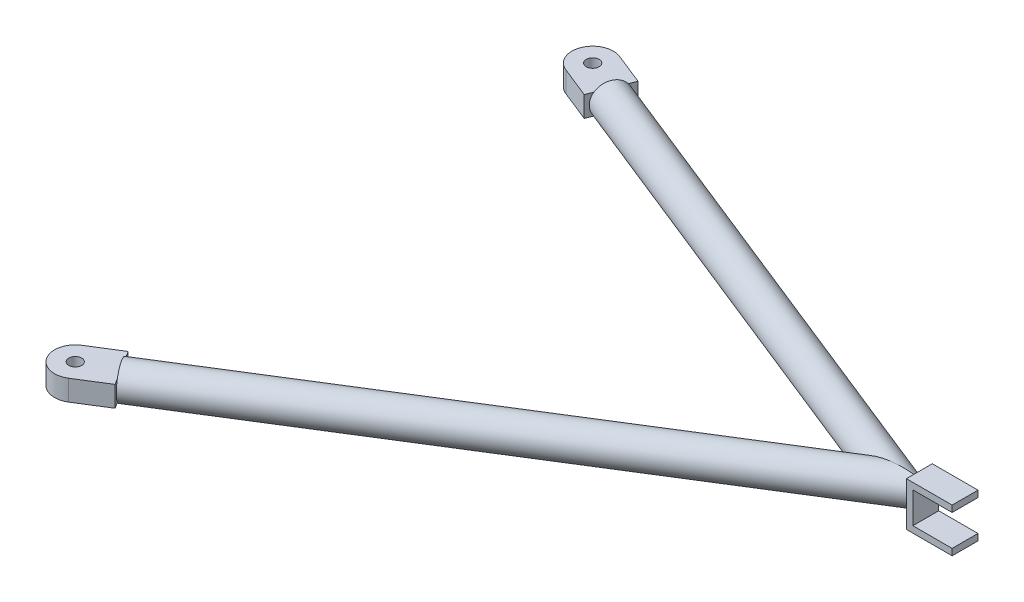
ISO-10303-21;
HEADER;
FILE_DESCRIPTION(('STEP AP214'),'2;1');
FILE_NAME('part.step','',(''),(''),'','','');
FILE_SCHEMA(('AUTOMOTIVE_DESIGN { 1 0 10303 214 1 1 1 1 }'));
ENDSEC;
DATA;
#1=APPLICATION_CONTEXT('core data for automotive mechanical design processes');
#2=APPLICATION_PROTOCOL_DEFINITION('international standard','automotive_design',2000,#1);
#3=PRODUCT_CONTEXT('',#1,'mechanical');
#4=PRODUCT('Part','Part','',(#3));
#5=PRODUCT_RELATED_PRODUCT_CATEGORY('part','',(#4));
#6=PRODUCT_DEFINITION_FORMATION('','',#4);
#7=PRODUCT_DEFINITION_CONTEXT('part definition',#1,'design');
#8=PRODUCT_DEFINITION('design','',#6,#7);
#9=PRODUCT_DEFINITION_SHAPE('','',#8);
#10=(LENGTH_UNIT() NAMED_UNIT(*) SI_UNIT(.MILLI.,.METRE.));
#11=(NAMED_UNIT(*) PLANE_ANGLE_UNIT() SI_UNIT($,.RADIAN.));
#12=(NAMED_UNIT(*) SI_UNIT($,.STERADIAN.) SOLID_ANGLE_UNIT());
#13=UNCERTAINTY_MEASURE_WITH_UNIT(LENGTH_MEASURE(1.E-05),#10,'distance_accuracy_value','');
#14=(GEOMETRIC_REPRESENTATION_CONTEXT(3) GLOBAL_UNCERTAINTY_ASSIGNED_CONTEXT((#13)) GLOBAL_UNIT_ASSIGNED_CONTEXT((#10,
#11,#12)) REPRESENTATION_CONTEXT('',''));
#15=CARTESIAN_POINT('',(0.,0.,0.));
#16=DIRECTION('',(0.,0.,1.));
#17=DIRECTION('',(1.,0.,0.));
#18=AXIS2_PLACEMENT_3D('',#15,#16,#17);
#19=CARTESIAN_POINT('',(-247.620690573304,0.,-99.06));
#20=DIRECTION('',(0.928461531958395,0.,0.371428571428571));
#21=DIRECTION('',(0.371428571428572,0.,-0.928461531958396));
#22=AXIS2_PLACEMENT_3D('',#19,#20,#21);
#23=CYLINDRICAL_SURFACE('',#22,8.25500000000001);
#24=CARTESIAN_POINT('',(11.8110000000001,0.,4.72495919985996));
#25=DIRECTION('',(-1.,0.,0.));
#26=DIRECTION('',(0.,0.,1.));
#27=AXIS2_PLACEMENT_3D('',#24,#25,#26);
#28=ELLIPSE('',#27,8.89105225780094,8.25500000000001);
#29=CARTESIAN_POINT('',(11.8110000000001,-6.27078691992011,-1.05733352724137));
#30=VERTEX_POINT('',#29);
#31=CARTESIAN_POINT('',(11.8110000000001,6.27078691992011,-1.05733352724137));
#32=VERTEX_POINT('',#31);
#33=EDGE_CURVE('E61',#30,#32,#28,.F.);
#34=ORIENTED_EDGE('',*,*,#33,.F.);
#35=CARTESIAN_POINT('',(0.,0.,0.));
#36=DIRECTION('',(0.0891645140120563,0.,0.996016912226391));
#37=DIRECTION('',(0.996016912226391,0.,-0.0891645140120563));
#38=AXIS2_PLACEMENT_3D('',#35,#36,#37);
#39=ELLIPSE('',#38,18.2336261333202,8.25500000000001);
#40=EDGE_CURVE('E225',#30,#32,#39,.F.);
#41=ORIENTED_EDGE('',*,*,#40,.T.);
#42=EDGE_LOOP('',(#34,#41));
#43=FACE_BOUND('',#42,.T.);
#44=CARTESIAN_POINT('',(-232.527619909788,0.,-93.0220571428572));
#45=DIRECTION('',(-0.928461531958395,0.,-0.371428571428572));
#46=DIRECTION('',(-0.371428571428572,0.,0.928461531958395));
#47=AXIS2_PLACEMENT_3D('',#44,#45,#46);
#48=CIRCLE('',#47,8.25500000000001);
#49=CARTESIAN_POINT('',(-234.944436440445,5.08,-86.9807308930058));
#50=VERTEX_POINT('',#49);
#51=CARTESIAN_POINT('',(-234.944436440445,-5.08,-86.9807308930058));
#52=VERTEX_POINT('',#51);
#53=EDGE_CURVE('E44',#50,#52,#48,.F.);
#54=ORIENTED_EDGE('',*,*,#53,.T.);
#55=CARTESIAN_POINT('',(-232.527619909788,0.,-93.0220571428572));
#56=DIRECTION('',(-0.928461531958395,0.,-0.371428571428572));
#57=DIRECTION('',(-0.371428571428572,0.,0.928461531958395));
#58=AXIS2_PLACEMENT_3D('',#55,#56,#57);
#59=CIRCLE('',#58,8.255);
#60=CARTESIAN_POINT('',(-230.110803379131,-5.08,-99.0633833927085));
#61=VERTEX_POINT('',#60);
#62=EDGE_CURVE('E194',#52,#61,#59,.F.);
#63=ORIENTED_EDGE('',*,*,#62,.T.);
#64=CARTESIAN_POINT('',(-230.110803379131,5.08,-99.0633833927085));
#65=VERTEX_POINT('',#64);
#66=EDGE_CURVE('E11',#61,#65,#48,.F.);
#67=ORIENTED_EDGE('',*,*,#66,.T.);
#68=CARTESIAN_POINT('',(-232.527619909788,0.,-93.0220571428572));
#69=DIRECTION('',(-0.928461531958395,0.,-0.371428571428572));
#70=DIRECTION('',(-0.371428571428572,0.,0.928461531958395));
#71=AXIS2_PLACEMENT_3D('',#68,#69,#70);
#72=CIRCLE('',#71,8.255);
#73=EDGE_CURVE('E214',#65,#50,#72,.F.);
#74=ORIENTED_EDGE('',*,*,#73,.T.);
#75=EDGE_LOOP('',(#54,#63,#67,#74));
#76=FACE_BOUND('',#75,.T.);
#77=ADVANCED_FACE('F40',(#43,#76),#23,.T.);
#78=CARTESIAN_POINT('',(15.2452595311789,0.,-9.53918877413676));
#79=DIRECTION('',(-0.847725746570709,0.,0.530434782608696));
#80=DIRECTION('',(0.530434782608696,0.,0.847725746570709));
#81=AXIS2_PLACEMENT_3D('',#78,#79,#80);
#82=CYLINDRICAL_SURFACE('',#81,8.25500000000001);
#83=CARTESIAN_POINT('',(11.8110000000001,0.,-7.39032079978092));
#84=DIRECTION('',(-1.,0.,0.));
#85=DIRECTION('',(0.,0.,1.));
#86=AXIS2_PLACEMENT_3D('',#83,#84,#85);
#87=ELLIPSE('',#86,9.73781913949626,8.25500000000001);
#88=EDGE_CURVE('E227',#32,#30,#87,.F.);
#89=ORIENTED_EDGE('',*,*,#88,.F.);
#90=ORIENTED_EDGE('',*,*,#40,.F.);
#91=EDGE_LOOP('',(#89,#90));
#92=FACE_BOUND('',#91,.T.);
#93=CARTESIAN_POINT('',(-233.624738497422,0.,146.182521739131));
#94=DIRECTION('',(-0.847725746570709,0.,0.530434782608696));
#95=DIRECTION('',(0.530434782608696,0.,0.847725746570709));
#96=AXIS2_PLACEMENT_3D('',#93,#94,#95);
#97=CIRCLE('',#96,8.25500000000001);
#98=CARTESIAN_POINT('',(-230.173298167688,5.08,151.698515271604));
#99=VERTEX_POINT('',#98);
#100=CARTESIAN_POINT('',(-230.173298167688,-5.08,151.698515271604));
#101=VERTEX_POINT('',#100);
#102=EDGE_CURVE('E217',#99,#101,#97,.F.);
#103=ORIENTED_EDGE('',*,*,#102,.T.);
#104=CARTESIAN_POINT('',(-233.624738497422,0.,146.182521739131));
#105=DIRECTION('',(-0.847725746570709,0.,0.530434782608696));
#106=DIRECTION('',(0.530434782608696,0.,0.847725746570709));
#107=AXIS2_PLACEMENT_3D('',#104,#105,#106);
#108=CIRCLE('',#107,8.25500000000002);
#109=CARTESIAN_POINT('',(-237.076178827156,-5.08,140.666528206658));
#110=VERTEX_POINT('',#109);
#111=EDGE_CURVE('E356',#101,#110,#108,.F.);
#112=ORIENTED_EDGE('',*,*,#111,.T.);
#113=CARTESIAN_POINT('',(-237.076178827156,5.08,140.666528206658));
#114=VERTEX_POINT('',#113);
#115=EDGE_CURVE('E215',#110,#114,#97,.F.);
#116=ORIENTED_EDGE('',*,*,#115,.T.);
#117=CARTESIAN_POINT('',(-233.624738497422,0.,146.182521739131));
#118=DIRECTION('',(-0.847725746570709,0.,0.530434782608696));
#119=DIRECTION('',(0.530434782608696,0.,0.847725746570709));
#120=AXIS2_PLACEMENT_3D('',#117,#118,#119);
#121=CIRCLE('',#120,8.25500000000002);
#122=EDGE_CURVE('E193',#114,#99,#121,.F.);
#123=ORIENTED_EDGE('',*,*,#122,.T.);
#124=EDGE_LOOP('',(#103,#112,#116,#123));
#125=FACE_BOUND('',#124,.T.);
#126=ADVANCED_FACE('F42',(#92,#125),#82,.T.);
#127=CARTESIAN_POINT('',(-239.013955888726,-5.08,137.569628153972));
#128=DIRECTION('',(0.,-1.,0.));
#129=DIRECTION('',(0.,0.,-1.));
#130=AXIS2_PLACEMENT_3D('',#127,#128,#129);
#131=PLANE('',#130);
#132=CARTESIAN_POINT('',(-247.620690573304,-5.08,154.94));
#133=DIRECTION('',(0.,-1.,0.));
#134=DIRECTION('',(0.,0.,-1.));
#135=AXIS2_PLACEMENT_3D('',#132,#133,#134);
#136=CIRCLE('',#135,3.175);
#137=CARTESIAN_POINT('',(-247.620690573304,-5.08,151.765));
#138=VERTEX_POINT('',#137);
#139=EDGE_CURVE('E361',#138,#138,#136,.T.);
#140=ORIENTED_EDGE('',*,*,#139,.F.);
#141=EDGE_LOOP('',(#140));
#142=FACE_BOUND('',#141,.T.);
#143=CARTESIAN_POINT('',(-247.620690573304,-5.08,154.94));
#144=DIRECTION('',(0.,-1.,0.));
#145=DIRECTION('',(0.,0.,-1.));
#146=AXIS2_PLACEMENT_3D('',#143,#144,#145);
#147=CIRCLE('',#146,10.16);
#148=CARTESIAN_POINT('',(-253.009907964609,-5.08,146.327106414842));
#149=VERTEX_POINT('',#148);
#150=CARTESIAN_POINT('',(-242.231473182,-5.08,163.552893585159));
#151=VERTEX_POINT('',#150);
#152=EDGE_CURVE('E345',#149,#151,#147,.F.);
#153=ORIENTED_EDGE('',*,*,#152,.F.);
#154=DIRECTION('',(-0.847725746570709,0.,0.530434782608696));
#155=VECTOR('',#154,1.);
#156=CARTESIAN_POINT('',(-239.013955888726,-5.08,137.569628153972));
#157=LINE('',#156,#155);
#158=CARTESIAN_POINT('',(-239.013955888726,-5.08,137.569628153972));
#159=VERTEX_POINT('',#158);
#160=EDGE_CURVE('E301',#159,#149,#157,.T.);
#161=ORIENTED_EDGE('',*,*,#160,.F.);
#162=DIRECTION('',(0.530434782608696,0.,0.847725746570709));
#163=VECTOR('',#162,1.);
#164=CARTESIAN_POINT('',(-239.013955888726,-5.08,137.569628153972));
#165=LINE('',#164,#163);
#166=EDGE_CURVE('E298',#159,#110,#165,.T.);
#167=ORIENTED_EDGE('',*,*,#166,.T.);
#168=DIRECTION('',(0.530434782608696,0.,0.847725746570709));
#169=VECTOR('',#168,1.);
#170=CARTESIAN_POINT('',(-230.173298167688,-5.08,151.698515271604));
#171=LINE('',#170,#169);
#172=EDGE_CURVE('E54',#110,#101,#171,.T.);
#173=ORIENTED_EDGE('',*,*,#172,.T.);
#174=CARTESIAN_POINT('',(-228.235521106118,-5.08,154.795415324289));
#175=VERTEX_POINT('',#174);
#176=EDGE_CURVE('E308',#101,#175,#165,.T.);
#177=ORIENTED_EDGE('',*,*,#176,.T.);
#178=DIRECTION('',(-0.847725746570709,0.,0.530434782608696));
#179=VECTOR('',#178,1.);
#180=CARTESIAN_POINT('',(-228.235521106118,-5.08,154.795415324289));
#181=LINE('',#180,#179);
#182=EDGE_CURVE('E293',#175,#151,#181,.T.);
#183=ORIENTED_EDGE('',*,*,#182,.T.);
#184=EDGE_LOOP('',(#153,#161,#167,#173,#177,#183));
#185=FACE_BOUND('',#184,.T.);
#186=ADVANCED_FACE('F412',(#142,#185),#131,.T.);
#187=CARTESIAN_POINT('',(-239.013955888726,5.08,137.569628153972));
#188=DIRECTION('',(-0.530434782608696,0.,-0.847725746570709));
#189=DIRECTION('',(-0.847725746570709,0.,0.530434782608696));
#190=AXIS2_PLACEMENT_3D('',#187,#188,#189);
#191=PLANE('',#190);
#192=ORIENTED_EDGE('',*,*,#160,.T.);
#193=DIRECTION('',(0.,1.,0.));
#194=VECTOR('',#193,1.);
#195=CARTESIAN_POINT('',(-253.009907964609,-10.795,146.327106414842));
#196=LINE('',#195,#194);
#197=CARTESIAN_POINT('',(-253.009907964609,5.08,146.327106414842));
#198=VERTEX_POINT('',#197);
#199=EDGE_CURVE('E351',#149,#198,#196,.T.);
#200=ORIENTED_EDGE('',*,*,#199,.T.);
#201=DIRECTION('',(-0.847725746570709,0.,0.530434782608696));
#202=VECTOR('',#201,1.);
#203=CARTESIAN_POINT('',(-239.013955888726,5.08,137.569628153972));
#204=LINE('',#203,#202);
#205=CARTESIAN_POINT('',(-239.013955888726,5.08,137.569628153972));
#206=VERTEX_POINT('',#205);
#207=EDGE_CURVE('E297',#206,#198,#204,.T.);
#208=ORIENTED_EDGE('',*,*,#207,.F.);
#209=DIRECTION('',(0.,-1.,0.));
#210=VECTOR('',#209,1.);
#211=CARTESIAN_POINT('',(-239.013955888726,5.08,137.569628153972));
#212=LINE('',#211,#210);
#213=EDGE_CURVE('E309',#206,#159,#212,.T.);
#214=ORIENTED_EDGE('',*,*,#213,.T.);
#215=EDGE_LOOP('',(#192,#200,#208,#214));
#216=FACE_BOUND('',#215,.T.);
#217=ADVANCED_FACE('F463',(#216),#191,.T.);
#218=CARTESIAN_POINT('',(-239.013955888726,5.08,137.569628153972));
#219=DIRECTION('',(0.,1.,0.));
#220=DIRECTION('',(0.,0.,1.));
#221=AXIS2_PLACEMENT_3D('',#218,#219,#220);
#222=PLANE('',#221);
#223=CARTESIAN_POINT('',(-247.620690573304,5.08,154.94));
#224=DIRECTION('',(0.,1.,0.));
#225=DIRECTION('',(0.,0.,1.));
#226=AXIS2_PLACEMENT_3D('',#223,#224,#225);
#227=CIRCLE('',#226,3.17500000000001);
#228=CARTESIAN_POINT('',(-247.620690573304,5.08,158.115));
#229=VERTEX_POINT('',#228);
#230=EDGE_CURVE('E365',#229,#229,#227,.T.);
#231=ORIENTED_EDGE('',*,*,#230,.F.);
#232=EDGE_LOOP('',(#231));
#233=FACE_BOUND('',#232,.T.);
#234=DIRECTION('',(-0.530434782608696,0.,-0.847725746570709));
#235=VECTOR('',#234,1.);
#236=CARTESIAN_POINT('',(-237.076178827156,5.08,140.666528206658));
#237=LINE('',#236,#235);
#238=EDGE_CURVE('E354',#99,#114,#237,.T.);
#239=ORIENTED_EDGE('',*,*,#238,.T.);
#240=DIRECTION('',(-0.530434782608696,0.,-0.847725746570709));
#241=VECTOR('',#240,1.);
#242=CARTESIAN_POINT('',(-239.013955888726,5.08,137.569628153972));
#243=LINE('',#242,#241);
#244=EDGE_CURVE('E315',#114,#206,#243,.T.);
#245=ORIENTED_EDGE('',*,*,#244,.T.);
#246=ORIENTED_EDGE('',*,*,#207,.T.);
#247=CARTESIAN_POINT('',(-247.620690573304,5.08,154.94));
#248=DIRECTION('',(0.,-1.,0.));
#249=DIRECTION('',(0.,0.,1.));
#250=AXIS2_PLACEMENT_3D('',#247,#248,#249);
#251=CIRCLE('',#250,10.16);
#252=CARTESIAN_POINT('',(-242.231473182,5.08,163.552893585159));
#253=VERTEX_POINT('',#252);
#254=EDGE_CURVE('E349',#253,#198,#251,.T.);
#255=ORIENTED_EDGE('',*,*,#254,.F.);
#256=DIRECTION('',(-0.847725746570709,0.,0.530434782608696));
#257=VECTOR('',#256,1.);
#258=CARTESIAN_POINT('',(-228.235521106118,5.08,154.795415324289));
#259=LINE('',#258,#257);
#260=CARTESIAN_POINT('',(-228.235521106118,5.08,154.795415324289));
#261=VERTEX_POINT('',#260);
#262=EDGE_CURVE('E294',#261,#253,#259,.T.);
#263=ORIENTED_EDGE('',*,*,#262,.F.);
#264=EDGE_CURVE('E312',#261,#99,#243,.T.);
#265=ORIENTED_EDGE('',*,*,#264,.T.);
#266=EDGE_LOOP('',(#239,#245,#246,#255,#263,#265));
#267=FACE_BOUND('',#266,.T.);
#268=ADVANCED_FACE('F459',(#233,#267),#222,.T.);
#269=CARTESIAN_POINT('',(-228.235521106118,5.08,154.795415324289));
#270=DIRECTION('',(0.530434782608696,0.,0.847725746570709));
#271=DIRECTION('',(0.847725746570709,0.,-0.530434782608696));
#272=AXIS2_PLACEMENT_3D('',#269,#270,#271);
#273=PLANE('',#272);
#274=ORIENTED_EDGE('',*,*,#262,.T.);
#275=DIRECTION('',(0.,1.,0.));
#276=VECTOR('',#275,1.);
#277=CARTESIAN_POINT('',(-242.231473182,-10.795,163.552893585159));
#278=LINE('',#277,#276);
#279=EDGE_CURVE('E347',#151,#253,#278,.T.);
#280=ORIENTED_EDGE('',*,*,#279,.F.);
#281=ORIENTED_EDGE('',*,*,#182,.F.);
#282=DIRECTION('',(0.,1.,0.));
#283=VECTOR('',#282,1.);
#284=CARTESIAN_POINT('',(-228.235521106118,5.08,154.795415324289));
#285=LINE('',#284,#283);
#286=EDGE_CURVE('E316',#175,#261,#285,.T.);
#287=ORIENTED_EDGE('',*,*,#286,.T.);
#288=EDGE_LOOP('',(#274,#280,#281,#287));
#289=FACE_BOUND('',#288,.T.);
#290=ADVANCED_FACE('F456',(#289),#273,.T.);
#291=CARTESIAN_POINT('',(-228.753905624074,-5.08,-102.455226307554));
#292=DIRECTION('',(0.,-1.,0.));
#293=DIRECTION('',(0.,0.,-1.));
#294=AXIS2_PLACEMENT_3D('',#291,#292,#293);
#295=PLANE('',#294);
#296=CARTESIAN_POINT('',(-247.620690573304,-5.08,-99.06));
#297=DIRECTION('',(0.,-1.,0.));
#298=DIRECTION('',(0.,0.,-1.));
#299=AXIS2_PLACEMENT_3D('',#296,#297,#298);
#300=CIRCLE('',#299,3.175);
#301=CARTESIAN_POINT('',(-247.620690573304,-5.08,-102.235));
#302=VERTEX_POINT('',#301);
#303=EDGE_CURVE('E368',#302,#302,#300,.T.);
#304=ORIENTED_EDGE('',*,*,#303,.F.);
#305=EDGE_LOOP('',(#304));
#306=FACE_BOUND('',#305,.T.);
#307=DIRECTION('',(-0.371428571428572,0.,0.928461531958395));
#308=VECTOR('',#307,1.);
#309=CARTESIAN_POINT('',(-234.944436440445,-5.08,-86.9807308930059));
#310=LINE('',#309,#308);
#311=EDGE_CURVE('E182',#61,#52,#310,.T.);
#312=ORIENTED_EDGE('',*,*,#311,.T.);
#313=DIRECTION('',(-0.371428571428572,0.,0.928461531958395));
#314=VECTOR('',#313,1.);
#315=CARTESIAN_POINT('',(-228.753905624074,-5.08,-102.455226307554));
#316=LINE('',#315,#314);
#317=CARTESIAN_POINT('',(-236.301334195503,-5.08,-83.5888879781599));
#318=VERTEX_POINT('',#317);
#319=EDGE_CURVE('E187',#52,#318,#316,.T.);
#320=ORIENTED_EDGE('',*,*,#319,.T.);
#321=DIRECTION('',(-0.928461531958396,0.,-0.371428571428572));
#322=VECTOR('',#321,1.);
#323=CARTESIAN_POINT('',(-236.301334195503,-5.08,-83.5888879781599));
#324=LINE('',#323,#322);
#325=CARTESIAN_POINT('',(-251.394404859018,-5.08,-89.6268308353027));
#326=VERTEX_POINT('',#325);
#327=EDGE_CURVE('E319',#318,#326,#324,.T.);
#328=ORIENTED_EDGE('',*,*,#327,.T.);
#329=CARTESIAN_POINT('',(-247.620690573304,-5.08,-99.06));
#330=DIRECTION('',(0.,-1.,0.));
#331=DIRECTION('',(0.,0.,-1.));
#332=AXIS2_PLACEMENT_3D('',#329,#330,#331);
#333=CIRCLE('',#332,10.16);
#334=CARTESIAN_POINT('',(-243.84697628759,-5.08,-108.493169164697));
#335=VERTEX_POINT('',#334);
#336=EDGE_CURVE('E336',#335,#326,#333,.F.);
#337=ORIENTED_EDGE('',*,*,#336,.F.);
#338=DIRECTION('',(-0.928461531958396,0.,-0.371428571428572));
#339=VECTOR('',#338,1.);
#340=CARTESIAN_POINT('',(-228.753905624074,-5.08,-102.455226307554));
#341=LINE('',#340,#339);
#342=CARTESIAN_POINT('',(-228.753905624074,-5.08,-102.455226307554));
#343=VERTEX_POINT('',#342);
#344=EDGE_CURVE('E326',#343,#335,#341,.T.);
#345=ORIENTED_EDGE('',*,*,#344,.F.);
#346=EDGE_CURVE('E190',#343,#61,#316,.T.);
#347=ORIENTED_EDGE('',*,*,#346,.T.);
#348=EDGE_LOOP('',(#312,#320,#328,#337,#345,#347));
#349=FACE_BOUND('',#348,.T.);
#350=ADVANCED_FACE('F184',(#306,#349),#295,.T.);
#351=CARTESIAN_POINT('',(-228.753905624074,5.08,-102.455226307554));
#352=DIRECTION('',(0.371428571428572,0.,-0.928461531958396));
#353=DIRECTION('',(-0.928461531958396,0.,-0.371428571428572));
#354=AXIS2_PLACEMENT_3D('',#351,#352,#353);
#355=PLANE('',#354);
#356=ORIENTED_EDGE('',*,*,#344,.T.);
#357=DIRECTION('',(0.,1.,0.));
#358=VECTOR('',#357,1.);
#359=CARTESIAN_POINT('',(-243.84697628759,-10.795,-108.493169164697));
#360=LINE('',#359,#358);
#361=CARTESIAN_POINT('',(-243.84697628759,5.08,-108.493169164697));
#362=VERTEX_POINT('',#361);
#363=EDGE_CURVE('E342',#335,#362,#360,.T.);
#364=ORIENTED_EDGE('',*,*,#363,.T.);
#365=DIRECTION('',(-0.928461531958396,0.,-0.371428571428572));
#366=VECTOR('',#365,1.);
#367=CARTESIAN_POINT('',(-228.753905624074,5.08,-102.455226307554));
#368=LINE('',#367,#366);
#369=CARTESIAN_POINT('',(-228.753905624074,5.08,-102.455226307554));
#370=VERTEX_POINT('',#369);
#371=EDGE_CURVE('E323',#370,#362,#368,.T.);
#372=ORIENTED_EDGE('',*,*,#371,.F.);
#373=DIRECTION('',(0.,-1.,0.));
#374=VECTOR('',#373,1.);
#375=CARTESIAN_POINT('',(-228.753905624074,5.08,-102.455226307554));
#376=LINE('',#375,#374);
#377=EDGE_CURVE('E210',#370,#343,#376,.T.);
#378=ORIENTED_EDGE('',*,*,#377,.T.);
#379=EDGE_LOOP('',(#356,#364,#372,#378));
#380=FACE_BOUND('',#379,.T.);
#381=ADVANCED_FACE('F381',(#380),#355,.T.);
#382=CARTESIAN_POINT('',(-228.753905624074,5.08,-102.455226307554));
#383=DIRECTION('',(0.,1.,0.));
#384=DIRECTION('',(0.,0.,1.));
#385=AXIS2_PLACEMENT_3D('',#382,#383,#384);
#386=PLANE('',#385);
#387=CARTESIAN_POINT('',(-247.620690573304,5.08,-99.06));
#388=DIRECTION('',(0.,1.,0.));
#389=DIRECTION('',(0.,0.,1.));
#390=AXIS2_PLACEMENT_3D('',#387,#388,#389);
#391=CIRCLE('',#390,3.17500000000001);
#392=CARTESIAN_POINT('',(-247.620690573304,5.08,-95.885));
#393=VERTEX_POINT('',#392);
#394=EDGE_CURVE('E371',#393,#393,#391,.T.);
#395=ORIENTED_EDGE('',*,*,#394,.F.);
#396=EDGE_LOOP('',(#395));
#397=FACE_BOUND('',#396,.T.);
#398=DIRECTION('',(0.371428571428572,0.,-0.928461531958395));
#399=VECTOR('',#398,1.);
#400=CARTESIAN_POINT('',(-230.110803379131,5.08,-99.0633833927085));
#401=LINE('',#400,#399);
#402=EDGE_CURVE('E200',#50,#65,#401,.T.);
#403=ORIENTED_EDGE('',*,*,#402,.T.);
#404=DIRECTION('',(0.371428571428572,0.,-0.928461531958395));
#405=VECTOR('',#404,1.);
#406=CARTESIAN_POINT('',(-228.753905624074,5.08,-102.455226307554));
#407=LINE('',#406,#405);
#408=EDGE_CURVE('E334',#65,#370,#407,.T.);
#409=ORIENTED_EDGE('',*,*,#408,.T.);
#410=ORIENTED_EDGE('',*,*,#371,.T.);
#411=CARTESIAN_POINT('',(-247.620690573304,5.08,-99.06));
#412=DIRECTION('',(0.,-1.,0.));
#413=DIRECTION('',(0.,0.,1.));
#414=AXIS2_PLACEMENT_3D('',#411,#412,#413);
#415=CIRCLE('',#414,10.16);
#416=CARTESIAN_POINT('',(-251.394404859018,5.08,-89.6268308353027));
#417=VERTEX_POINT('',#416);
#418=EDGE_CURVE('E340',#417,#362,#415,.T.);
#419=ORIENTED_EDGE('',*,*,#418,.F.);
#420=DIRECTION('',(-0.928461531958396,0.,-0.371428571428572));
#421=VECTOR('',#420,1.);
#422=CARTESIAN_POINT('',(-236.301334195503,5.08,-83.5888879781599));
#423=LINE('',#422,#421);
#424=CARTESIAN_POINT('',(-236.301334195503,5.08,-83.5888879781599));
#425=VERTEX_POINT('',#424);
#426=EDGE_CURVE('E320',#425,#417,#423,.T.);
#427=ORIENTED_EDGE('',*,*,#426,.F.);
#428=EDGE_CURVE('E332',#425,#50,#407,.T.);
#429=ORIENTED_EDGE('',*,*,#428,.T.);
#430=EDGE_LOOP('',(#403,#409,#410,#419,#427,#429));
#431=FACE_BOUND('',#430,.T.);
#432=ADVANCED_FACE('F377',(#397,#431),#386,.T.);
#433=CARTESIAN_POINT('',(-236.301334195503,5.08,-83.5888879781599));
#434=DIRECTION('',(-0.371428571428572,0.,0.928461531958396));
#435=DIRECTION('',(0.928461531958396,0.,0.371428571428572));
#436=AXIS2_PLACEMENT_3D('',#433,#434,#435);
#437=PLANE('',#436);
#438=ORIENTED_EDGE('',*,*,#426,.T.);
#439=DIRECTION('',(0.,1.,0.));
#440=VECTOR('',#439,1.);
#441=CARTESIAN_POINT('',(-251.394404859018,-10.795,-89.6268308353027));
#442=LINE('',#441,#440);
#443=EDGE_CURVE('E338',#326,#417,#442,.T.);
#444=ORIENTED_EDGE('',*,*,#443,.F.);
#445=ORIENTED_EDGE('',*,*,#327,.F.);
#446=DIRECTION('',(0.,1.,0.));
#447=VECTOR('',#446,1.);
#448=CARTESIAN_POINT('',(-236.301334195503,5.08,-83.5888879781599));
#449=LINE('',#448,#447);
#450=EDGE_CURVE('E209',#318,#425,#449,.T.);
#451=ORIENTED_EDGE('',*,*,#450,.T.);
#452=EDGE_LOOP('',(#438,#444,#445,#451));
#453=FACE_BOUND('',#452,.T.);
#454=ADVANCED_FACE('F380',(#453),#437,.T.);
#455=CARTESIAN_POINT('',(34.2566729305824,-7.62,-6.35));
#456=DIRECTION('',(1.,0.,0.));
#457=DIRECTION('',(0.,1.,0.));
#458=AXIS2_PLACEMENT_3D('',#455,#456,#457);
#459=PLANE('',#458);
#460=DIRECTION('',(0.,0.,1.));
#461=VECTOR('',#460,1.);
#462=CARTESIAN_POINT('',(34.2566729305824,-7.62,-6.35));
#463=LINE('',#462,#461);
#464=CARTESIAN_POINT('',(34.2566729305824,-7.62,-6.35));
#465=VERTEX_POINT('',#464);
#466=CARTESIAN_POINT('',(34.2566729305824,-7.62,6.35));
#467=VERTEX_POINT('',#466);
#468=EDGE_CURVE('E231',#465,#467,#463,.T.);
#469=ORIENTED_EDGE('',*,*,#468,.T.);
#470=DIRECTION('',(0.,1.,0.));
#471=VECTOR('',#470,1.);
#472=CARTESIAN_POINT('',(34.2566729305824,-7.62,6.35));
#473=LINE('',#472,#471);
#474=CARTESIAN_POINT('',(34.2566729305824,-10.795,6.35));
#475=VERTEX_POINT('',#474);
#476=EDGE_CURVE('E290',#475,#467,#473,.T.);
#477=ORIENTED_EDGE('',*,*,#476,.F.);
#478=DIRECTION('',(0.,0.,1.));
#479=VECTOR('',#478,1.);
#480=CARTESIAN_POINT('',(34.2566729305824,-10.795,-6.35));
#481=LINE('',#480,#479);
#482=CARTESIAN_POINT('',(34.2566729305824,-10.795,-6.35));
#483=VERTEX_POINT('',#482);
#484=EDGE_CURVE('E230',#483,#475,#481,.T.);
#485=ORIENTED_EDGE('',*,*,#484,.F.);
#486=DIRECTION('',(0.,1.,0.));
#487=VECTOR('',#486,1.);
#488=CARTESIAN_POINT('',(34.2566729305824,-7.62,-6.35));
#489=LINE('',#488,#487);
#490=EDGE_CURVE('E267',#483,#465,#489,.T.);
#491=ORIENTED_EDGE('',*,*,#490,.T.);
#492=EDGE_LOOP('',(#469,#477,#485,#491));
#493=FACE_BOUND('',#492,.T.);
#494=ADVANCED_FACE('F415',(#493),#459,.T.);
#495=CARTESIAN_POINT('',(34.2566729305824,-10.795,-6.35));
#496=DIRECTION('',(0.,-1.,0.));
#497=DIRECTION('',(1.,0.,0.));
#498=AXIS2_PLACEMENT_3D('',#495,#496,#497);
#499=PLANE('',#498);
#500=ORIENTED_EDGE('',*,*,#484,.T.);
#501=DIRECTION('',(1.,0.,0.));
#502=VECTOR('',#501,1.);
#503=CARTESIAN_POINT('',(34.2566729305824,-10.795,6.35));
#504=LINE('',#503,#502);
#505=CARTESIAN_POINT('',(11.8110000000001,-10.795,6.35));
#506=VERTEX_POINT('',#505);
#507=EDGE_CURVE('E270',#506,#475,#504,.T.);
#508=ORIENTED_EDGE('',*,*,#507,.F.);
#509=DIRECTION('',(0.,0.,1.));
#510=VECTOR('',#509,1.);
#511=CARTESIAN_POINT('',(11.8110000000001,-10.795,-6.35));
#512=LINE('',#511,#510);
#513=CARTESIAN_POINT('',(11.8110000000001,-10.795,-6.35));
#514=VERTEX_POINT('',#513);
#515=EDGE_CURVE('E245',#514,#506,#512,.T.);
#516=ORIENTED_EDGE('',*,*,#515,.F.);
#517=DIRECTION('',(1.,0.,0.));
#518=VECTOR('',#517,1.);
#519=CARTESIAN_POINT('',(34.2566729305824,-10.795,-6.35));
#520=LINE('',#519,#518);
#521=EDGE_CURVE('E234',#514,#483,#520,.T.);
#522=ORIENTED_EDGE('',*,*,#521,.T.);
#523=EDGE_LOOP('',(#500,#508,#516,#522));
#524=FACE_BOUND('',#523,.T.);
#525=ADVANCED_FACE('F418',(#524),#499,.T.);
#526=CARTESIAN_POINT('',(11.8110000000001,-10.795,-6.35));
#527=DIRECTION('',(-1.,0.,0.));
#528=DIRECTION('',(0.,0.,1.));
#529=AXIS2_PLACEMENT_3D('',#526,#527,#528);
#530=PLANE('',#529);
#531=ORIENTED_EDGE('',*,*,#33,.T.);
#532=ORIENTED_EDGE('',*,*,#88,.T.);
#533=EDGE_LOOP('',(#531,#532));
#534=FACE_BOUND('',#533,.T.);
#535=ORIENTED_EDGE('',*,*,#515,.T.);
#536=DIRECTION('',(0.,-1.,0.));
#537=VECTOR('',#536,1.);
#538=CARTESIAN_POINT('',(11.8110000000001,-10.795,6.35));
#539=LINE('',#538,#537);
#540=CARTESIAN_POINT('',(11.8110000000001,10.795,6.35));
#541=VERTEX_POINT('',#540);
#542=EDGE_CURVE('E273',#541,#506,#539,.T.);
#543=ORIENTED_EDGE('',*,*,#542,.F.);
#544=DIRECTION('',(0.,0.,1.));
#545=VECTOR('',#544,1.);
#546=CARTESIAN_POINT('',(11.8110000000001,10.795,-6.35));
#547=LINE('',#546,#545);
#548=CARTESIAN_POINT('',(11.8110000000001,10.795,-6.35));
#549=VERTEX_POINT('',#548);
#550=EDGE_CURVE('E243',#549,#541,#547,.T.);
#551=ORIENTED_EDGE('',*,*,#550,.F.);
#552=DIRECTION('',(0.,-1.,0.));
#553=VECTOR('',#552,1.);
#554=CARTESIAN_POINT('',(11.8110000000001,-10.795,-6.35));
#555=LINE('',#554,#553);
#556=EDGE_CURVE('E250',#549,#514,#555,.T.);
#557=ORIENTED_EDGE('',*,*,#556,.T.);
#558=EDGE_LOOP('',(#535,#543,#551,#557));
#559=FACE_BOUND('',#558,.T.);
#560=ADVANCED_FACE('F440',(#534,#559),#530,.T.);
#561=CARTESIAN_POINT('',(11.8110000000001,10.795,-6.35));
#562=DIRECTION('',(0.,1.,0.));
#563=DIRECTION('',(-1.,0.,0.));
#564=AXIS2_PLACEMENT_3D('',#561,#562,#563);
#565=PLANE('',#564);
#566=ORIENTED_EDGE('',*,*,#550,.T.);
#567=DIRECTION('',(-1.,0.,0.));
#568=VECTOR('',#567,1.);
#569=CARTESIAN_POINT('',(11.8110000000001,10.795,6.35));
#570=LINE('',#569,#568);
#571=CARTESIAN_POINT('',(34.2566729305824,10.795,6.35));
#572=VERTEX_POINT('',#571);
#573=EDGE_CURVE('E276',#572,#541,#570,.T.);
#574=ORIENTED_EDGE('',*,*,#573,.F.);
#575=DIRECTION('',(0.,0.,1.));
#576=VECTOR('',#575,1.);
#577=CARTESIAN_POINT('',(34.2566729305824,10.795,-6.35));
#578=LINE('',#577,#576);
#579=CARTESIAN_POINT('',(34.2566729305824,10.795,-6.35));
#580=VERTEX_POINT('',#579);
#581=EDGE_CURVE('E241',#580,#572,#578,.T.);
#582=ORIENTED_EDGE('',*,*,#581,.F.);
#583=DIRECTION('',(-1.,0.,0.));
#584=VECTOR('',#583,1.);
#585=CARTESIAN_POINT('',(11.8110000000001,10.795,-6.35));
#586=LINE('',#585,#584);
#587=EDGE_CURVE('E253',#580,#549,#586,.T.);
#588=ORIENTED_EDGE('',*,*,#587,.T.);
#589=EDGE_LOOP('',(#566,#574,#582,#588));
#590=FACE_BOUND('',#589,.T.);
#591=ADVANCED_FACE('F436',(#590),#565,.T.);
#592=CARTESIAN_POINT('',(34.2566729305824,10.795,-6.35));
#593=DIRECTION('',(1.,0.,0.));
#594=DIRECTION('',(0.,1.,0.));
#595=AXIS2_PLACEMENT_3D('',#592,#593,#594);
#596=PLANE('',#595);
#597=ORIENTED_EDGE('',*,*,#581,.T.);
#598=DIRECTION('',(0.,1.,0.));
#599=VECTOR('',#598,1.);
#600=CARTESIAN_POINT('',(34.2566729305824,10.795,6.35));
#601=LINE('',#600,#599);
#602=CARTESIAN_POINT('',(34.2566729305824,7.62,6.35));
#603=VERTEX_POINT('',#602);
#604=EDGE_CURVE('E279',#603,#572,#601,.T.);
#605=ORIENTED_EDGE('',*,*,#604,.F.);
#606=DIRECTION('',(0.,0.,1.));
#607=VECTOR('',#606,1.);
#608=CARTESIAN_POINT('',(34.2566729305824,7.62,-6.35));
#609=LINE('',#608,#607);
#610=CARTESIAN_POINT('',(34.2566729305824,7.62,-6.35));
#611=VERTEX_POINT('',#610);
#612=EDGE_CURVE('E239',#611,#603,#609,.T.);
#613=ORIENTED_EDGE('',*,*,#612,.F.);
#614=DIRECTION('',(0.,1.,0.));
#615=VECTOR('',#614,1.);
#616=CARTESIAN_POINT('',(34.2566729305824,10.795,-6.35));
#617=LINE('',#616,#615);
#618=EDGE_CURVE('E256',#611,#580,#617,.T.);
#619=ORIENTED_EDGE('',*,*,#618,.T.);
#620=EDGE_LOOP('',(#597,#605,#613,#619));
#621=FACE_BOUND('',#620,.T.);
#622=ADVANCED_FACE('F432',(#621),#596,.T.);
#623=CARTESIAN_POINT('',(34.2566729305824,7.62,-6.35));
#624=DIRECTION('',(0.,-1.,0.));
#625=DIRECTION('',(0.,0.,-1.));
#626=AXIS2_PLACEMENT_3D('',#623,#624,#625);
#627=PLANE('',#626);
#628=ORIENTED_EDGE('',*,*,#612,.T.);
#629=DIRECTION('',(1.,0.,0.));
#630=VECTOR('',#629,1.);
#631=CARTESIAN_POINT('',(34.2566729305824,7.62,6.35));
#632=LINE('',#631,#630);
#633=CARTESIAN_POINT('',(14.986,7.62,6.35));
#634=VERTEX_POINT('',#633);
#635=EDGE_CURVE('E282',#634,#603,#632,.T.);
#636=ORIENTED_EDGE('',*,*,#635,.F.);
#637=DIRECTION('',(0.,0.,1.));
#638=VECTOR('',#637,1.);
#639=CARTESIAN_POINT('',(14.986,7.62,-6.35));
#640=LINE('',#639,#638);
#641=CARTESIAN_POINT('',(14.986,7.62,-6.35));
#642=VERTEX_POINT('',#641);
#643=EDGE_CURVE('E236',#642,#634,#640,.T.);
#644=ORIENTED_EDGE('',*,*,#643,.F.);
#645=DIRECTION('',(1.,0.,0.));
#646=VECTOR('',#645,1.);
#647=CARTESIAN_POINT('',(34.2566729305824,7.62,-6.35));
#648=LINE('',#647,#646);
#649=EDGE_CURVE('E259',#642,#611,#648,.T.);
#650=ORIENTED_EDGE('',*,*,#649,.T.);
#651=EDGE_LOOP('',(#628,#636,#644,#650));
#652=FACE_BOUND('',#651,.T.);
#653=ADVANCED_FACE('F428',(#652),#627,.T.);
#654=CARTESIAN_POINT('',(14.986,7.62,-6.35));
#655=DIRECTION('',(1.,0.,0.));
#656=DIRECTION('',(0.,0.,-1.));
#657=AXIS2_PLACEMENT_3D('',#654,#655,#656);
#658=PLANE('',#657);
#659=ORIENTED_EDGE('',*,*,#643,.T.);
#660=DIRECTION('',(0.,1.,0.));
#661=VECTOR('',#660,1.);
#662=CARTESIAN_POINT('',(14.986,7.62,6.35));
#663=LINE('',#662,#661);
#664=CARTESIAN_POINT('',(14.986,-7.62,6.35));
#665=VERTEX_POINT('',#664);
#666=EDGE_CURVE('E285',#665,#634,#663,.T.);
#667=ORIENTED_EDGE('',*,*,#666,.F.);
#668=DIRECTION('',(0.,0.,1.));
#669=VECTOR('',#668,1.);
#670=CARTESIAN_POINT('',(14.986,-7.62,-6.35));
#671=LINE('',#670,#669);
#672=CARTESIAN_POINT('',(14.986,-7.62,-6.35));
#673=VERTEX_POINT('',#672);
#674=EDGE_CURVE('E233',#673,#665,#671,.T.);
#675=ORIENTED_EDGE('',*,*,#674,.F.);
#676=DIRECTION('',(0.,1.,0.));
#677=VECTOR('',#676,1.);
#678=CARTESIAN_POINT('',(14.986,7.62,-6.35));
#679=LINE('',#678,#677);
#680=EDGE_CURVE('E262',#673,#642,#679,.T.);
#681=ORIENTED_EDGE('',*,*,#680,.T.);
#682=EDGE_LOOP('',(#659,#667,#675,#681));
#683=FACE_BOUND('',#682,.T.);
#684=ADVANCED_FACE('F424',(#683),#658,.T.);
#685=CARTESIAN_POINT('',(14.986,-7.62,-6.35));
#686=DIRECTION('',(0.,1.,0.));
#687=DIRECTION('',(0.,0.,1.));
#688=AXIS2_PLACEMENT_3D('',#685,#686,#687);
#689=PLANE('',#688);
#690=ORIENTED_EDGE('',*,*,#674,.T.);
#691=DIRECTION('',(-1.,0.,0.));
#692=VECTOR('',#691,1.);
#693=CARTESIAN_POINT('',(14.986,-7.62,6.35));
#694=LINE('',#693,#692);
#695=EDGE_CURVE('E287',#467,#665,#694,.T.);
#696=ORIENTED_EDGE('',*,*,#695,.F.);
#697=ORIENTED_EDGE('',*,*,#468,.F.);
#698=DIRECTION('',(-1.,0.,0.));
#699=VECTOR('',#698,1.);
#700=CARTESIAN_POINT('',(14.986,-7.62,-6.35));
#701=LINE('',#700,#699);
#702=EDGE_CURVE('E264',#465,#673,#701,.T.);
#703=ORIENTED_EDGE('',*,*,#702,.T.);
#704=EDGE_LOOP('',(#690,#696,#697,#703));
#705=FACE_BOUND('',#704,.T.);
#706=ADVANCED_FACE('F420',(#705),#689,.T.);
#707=CARTESIAN_POINT('',(0.,0.,-6.35));
#708=DIRECTION('',(0.,0.,-1.));
#709=DIRECTION('',(-1.,0.,0.));
#710=AXIS2_PLACEMENT_3D('',#707,#708,#709);
#711=PLANE('',#710);
#712=ORIENTED_EDGE('',*,*,#490,.F.);
#713=ORIENTED_EDGE('',*,*,#521,.F.);
#714=ORIENTED_EDGE('',*,*,#556,.F.);
#715=ORIENTED_EDGE('',*,*,#587,.F.);
#716=ORIENTED_EDGE('',*,*,#618,.F.);
#717=ORIENTED_EDGE('',*,*,#649,.F.);
#718=ORIENTED_EDGE('',*,*,#680,.F.);
#719=ORIENTED_EDGE('',*,*,#702,.F.);
#720=EDGE_LOOP('',(#712,#713,#714,#715,#716,#717,#718,#719));
#721=FACE_BOUND('',#720,.T.);
#722=ADVANCED_FACE('F423',(#721),#711,.T.);
#723=CARTESIAN_POINT('',(0.,0.,6.35));
#724=DIRECTION('',(0.,0.,-1.));
#725=DIRECTION('',(-1.,0.,0.));
#726=AXIS2_PLACEMENT_3D('',#723,#724,#725);
#727=PLANE('',#726);
#728=ORIENTED_EDGE('',*,*,#476,.T.);
#729=ORIENTED_EDGE('',*,*,#695,.T.);
#730=ORIENTED_EDGE('',*,*,#666,.T.);
#731=ORIENTED_EDGE('',*,*,#635,.T.);
#732=ORIENTED_EDGE('',*,*,#604,.T.);
#733=ORIENTED_EDGE('',*,*,#573,.T.);
#734=ORIENTED_EDGE('',*,*,#542,.T.);
#735=ORIENTED_EDGE('',*,*,#507,.T.);
#736=EDGE_LOOP('',(#728,#729,#730,#731,#732,#733,#734,#735));
#737=FACE_BOUND('',#736,.T.);
#738=ADVANCED_FACE('F450',(#737),#727,.F.);
#739=CARTESIAN_POINT('',(-233.624738497422,0.,146.182521739131));
#740=DIRECTION('',(-0.847725746570709,0.,0.530434782608696));
#741=DIRECTION('',(0.530434782608696,0.,0.847725746570709));
#742=AXIS2_PLACEMENT_3D('',#739,#740,#741);
#743=PLANE('',#742);
#744=ORIENTED_EDGE('',*,*,#115,.F.);
#745=ORIENTED_EDGE('',*,*,#166,.F.);
#746=ORIENTED_EDGE('',*,*,#213,.F.);
#747=ORIENTED_EDGE('',*,*,#244,.F.);
#748=EDGE_LOOP('',(#744,#745,#746,#747));
#749=FACE_BOUND('',#748,.T.);
#750=ADVANCED_FACE('F454',(#749),#743,.F.);
#751=ORIENTED_EDGE('',*,*,#102,.F.);
#752=ORIENTED_EDGE('',*,*,#264,.F.);
#753=ORIENTED_EDGE('',*,*,#286,.F.);
#754=ORIENTED_EDGE('',*,*,#176,.F.);
#755=EDGE_LOOP('',(#751,#752,#753,#754));
#756=FACE_BOUND('',#755,.T.);
#757=ADVANCED_FACE('F471',(#756),#743,.F.);
#758=CARTESIAN_POINT('',(-232.527619909788,0.,-93.0220571428574));
#759=DIRECTION('',(-0.928461531958395,0.,-0.371428571428572));
#760=DIRECTION('',(-0.371428571428572,0.,0.928461531958395));
#761=AXIS2_PLACEMENT_3D('',#758,#759,#760);
#762=PLANE('',#761);
#763=ORIENTED_EDGE('',*,*,#66,.F.);
#764=ORIENTED_EDGE('',*,*,#346,.F.);
#765=ORIENTED_EDGE('',*,*,#377,.F.);
#766=ORIENTED_EDGE('',*,*,#408,.F.);
#767=EDGE_LOOP('',(#763,#764,#765,#766));
#768=FACE_BOUND('',#767,.T.);
#769=ADVANCED_FACE('F389',(#768),#762,.F.);
#770=ORIENTED_EDGE('',*,*,#53,.F.);
#771=ORIENTED_EDGE('',*,*,#428,.F.);
#772=ORIENTED_EDGE('',*,*,#450,.F.);
#773=ORIENTED_EDGE('',*,*,#319,.F.);
#774=EDGE_LOOP('',(#770,#771,#772,#773));
#775=FACE_BOUND('',#774,.T.);
#776=ADVANCED_FACE('F205',(#775),#762,.F.);
#777=CARTESIAN_POINT('',(-247.620690573304,-10.795,-99.06));
#778=DIRECTION('',(0.,1.,0.));
#779=DIRECTION('',(0.,0.,1.));
#780=AXIS2_PLACEMENT_3D('',#777,#778,#779);
#781=CYLINDRICAL_SURFACE('',#780,10.16);
#782=ORIENTED_EDGE('',*,*,#336,.T.);
#783=ORIENTED_EDGE('',*,*,#443,.T.);
#784=ORIENTED_EDGE('',*,*,#418,.T.);
#785=ORIENTED_EDGE('',*,*,#363,.F.);
#786=EDGE_LOOP('',(#782,#783,#784,#785));
#787=FACE_BOUND('',#786,.T.);
#788=ADVANCED_FACE('F396',(#787),#781,.T.);
#789=CARTESIAN_POINT('',(-247.620690573304,-10.795,154.94));
#790=DIRECTION('',(0.,1.,0.));
#791=DIRECTION('',(0.,0.,1.));
#792=AXIS2_PLACEMENT_3D('',#789,#790,#791);
#793=CYLINDRICAL_SURFACE('',#792,10.16);
#794=ORIENTED_EDGE('',*,*,#152,.T.);
#795=ORIENTED_EDGE('',*,*,#279,.T.);
#796=ORIENTED_EDGE('',*,*,#254,.T.);
#797=ORIENTED_EDGE('',*,*,#199,.F.);
#798=EDGE_LOOP('',(#794,#795,#796,#797));
#799=FACE_BOUND('',#798,.T.);
#800=ADVANCED_FACE('F398',(#799),#793,.T.);
#801=CARTESIAN_POINT('',(-233.624738497422,0.,146.182521739131));
#802=DIRECTION('',(-0.847725746570709,0.,0.530434782608696));
#803=DIRECTION('',(0.530434782608696,0.,0.847725746570709));
#804=AXIS2_PLACEMENT_3D('',#801,#802,#803);
#805=PLANE('',#804);
#806=ORIENTED_EDGE('',*,*,#122,.F.);
#807=ORIENTED_EDGE('',*,*,#238,.F.);
#808=EDGE_LOOP('',(#806,#807));
#809=FACE_BOUND('',#808,.T.);
#810=ADVANCED_FACE('F404',(#809),#805,.T.);
#811=CARTESIAN_POINT('',(-233.624738497422,0.,146.182521739131));
#812=DIRECTION('',(-0.847725746570709,0.,0.530434782608696));
#813=DIRECTION('',(0.530434782608696,0.,0.847725746570709));
#814=AXIS2_PLACEMENT_3D('',#811,#812,#813);
#815=PLANE('',#814);
#816=ORIENTED_EDGE('',*,*,#111,.F.);
#817=ORIENTED_EDGE('',*,*,#172,.F.);
#818=EDGE_LOOP('',(#816,#817));
#819=FACE_BOUND('',#818,.T.);
#820=ADVANCED_FACE('F498',(#819),#815,.T.);
#821=CARTESIAN_POINT('',(-232.527619909788,0.,-93.0220571428574));
#822=DIRECTION('',(-0.928461531958395,0.,-0.371428571428572));
#823=DIRECTION('',(-0.371428571428572,0.,0.928461531958395));
#824=AXIS2_PLACEMENT_3D('',#821,#822,#823);
#825=PLANE('',#824);
#826=ORIENTED_EDGE('',*,*,#73,.F.);
#827=ORIENTED_EDGE('',*,*,#402,.F.);
#828=EDGE_LOOP('',(#826,#827));
#829=FACE_BOUND('',#828,.T.);
#830=ADVANCED_FACE('F386',(#829),#825,.T.);
#831=CARTESIAN_POINT('',(-232.527619909788,0.,-93.0220571428574));
#832=DIRECTION('',(-0.928461531958395,0.,-0.371428571428572));
#833=DIRECTION('',(-0.371428571428572,0.,0.928461531958395));
#834=AXIS2_PLACEMENT_3D('',#831,#832,#833);
#835=PLANE('',#834);
#836=ORIENTED_EDGE('',*,*,#62,.F.);
#837=ORIENTED_EDGE('',*,*,#311,.F.);
#838=EDGE_LOOP('',(#836,#837));
#839=FACE_BOUND('',#838,.T.);
#840=ADVANCED_FACE('F196',(#839),#835,.T.);
#841=CARTESIAN_POINT('',(-247.620690573304,5.08,154.94));
#842=DIRECTION('',(0.,1.,0.));
#843=DIRECTION('',(0.,0.,1.));
#844=AXIS2_PLACEMENT_3D('',#841,#842,#843);
#845=CYLINDRICAL_SURFACE('',#844,3.175);
#846=ORIENTED_EDGE('',*,*,#139,.T.);
#847=EDGE_LOOP('',(#846));
#848=FACE_BOUND('',#847,.T.);
#849=ORIENTED_EDGE('',*,*,#230,.T.);
#850=EDGE_LOOP('',(#849));
#851=FACE_BOUND('',#850,.T.);
#852=ADVANCED_FACE('F486',(#848,#851),#845,.F.);
#853=CARTESIAN_POINT('',(-247.620690573304,5.08,-99.06));
#854=DIRECTION('',(0.,1.,0.));
#855=DIRECTION('',(0.,0.,1.));
#856=AXIS2_PLACEMENT_3D('',#853,#854,#855);
#857=CYLINDRICAL_SURFACE('',#856,3.175);
#858=ORIENTED_EDGE('',*,*,#303,.T.);
#859=EDGE_LOOP('',(#858));
#860=FACE_BOUND('',#859,.T.);
#861=ORIENTED_EDGE('',*,*,#394,.T.);
#862=EDGE_LOOP('',(#861));
#863=FACE_BOUND('',#862,.T.);
#864=ADVANCED_FACE('F375',(#860,#863),#857,.F.);
#865=CLOSED_SHELL('',(#77,#126,#186,#217,#268,#290,#350,#381,#432,#454,#494,#525,#560,#591,#622,
#653,#684,#706,#722,#738,#750,#757,#769,#776,#788,#800,#810,#820,#830,#840,#852,#864));
#866=MANIFOLD_SOLID_BREP('B2',#865);
#867=ADVANCED_BREP_SHAPE_REPRESENTATION('',(#18,#866),#14);
#868=SHAPE_DEFINITION_REPRESENTATION(#9,#867);
ENDSEC;
END-ISO-10303-21;
